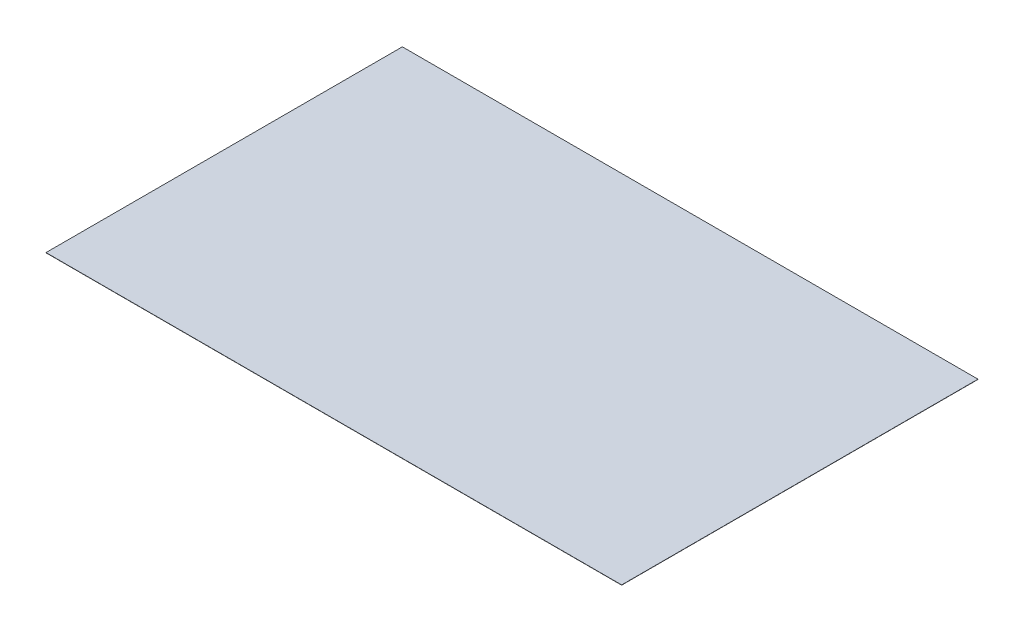
ISO-10303-21;
HEADER;
FILE_DESCRIPTION(('STEP AP214'),'2;1');
FILE_NAME('part.step','',(''),(''),'','','');
FILE_SCHEMA(('AUTOMOTIVE_DESIGN { 1 0 10303 214 1 1 1 1 }'));
ENDSEC;
DATA;
#1=APPLICATION_CONTEXT('core data for automotive mechanical design processes');
#2=APPLICATION_PROTOCOL_DEFINITION('international standard','automotive_design',2000,#1);
#3=PRODUCT_CONTEXT('',#1,'mechanical');
#4=PRODUCT('Part','Part','',(#3));
#5=PRODUCT_RELATED_PRODUCT_CATEGORY('part','',(#4));
#6=PRODUCT_DEFINITION_FORMATION('','',#4);
#7=PRODUCT_DEFINITION_CONTEXT('part definition',#1,'design');
#8=PRODUCT_DEFINITION('design','',#6,#7);
#9=PRODUCT_DEFINITION_SHAPE('','',#8);
#10=(LENGTH_UNIT() NAMED_UNIT(*) SI_UNIT(.MILLI.,.METRE.));
#11=(NAMED_UNIT(*) PLANE_ANGLE_UNIT() SI_UNIT($,.RADIAN.));
#12=(NAMED_UNIT(*) SI_UNIT($,.STERADIAN.) SOLID_ANGLE_UNIT());
#13=UNCERTAINTY_MEASURE_WITH_UNIT(LENGTH_MEASURE(1.E-05),#10,'distance_accuracy_value','');
#14=(GEOMETRIC_REPRESENTATION_CONTEXT(3) GLOBAL_UNCERTAINTY_ASSIGNED_CONTEXT((#13)) GLOBAL_UNIT_ASSIGNED_CONTEXT((#10,
#11,#12)) REPRESENTATION_CONTEXT('',''));
#15=CARTESIAN_POINT('',(0.,0.,0.));
#16=DIRECTION('',(0.,0.,1.));
#17=DIRECTION('',(1.,0.,0.));
#18=AXIS2_PLACEMENT_3D('',#15,#16,#17);
#19=CARTESIAN_POINT('',(-64008.,50.8,-39624.));
#20=DIRECTION('',(1.,0.,0.));
#21=DIRECTION('',(0.,0.,-1.));
#22=AXIS2_PLACEMENT_3D('',#19,#20,#21);
#23=PLANE('',#22);
#24=DIRECTION('',(0.,0.,1.));
#25=VECTOR('',#24,1.);
#26=CARTESIAN_POINT('',(-64008.,0.,-39624.));
#27=LINE('',#26,#25);
#28=CARTESIAN_POINT('',(-64008.,0.,-39624.));
#29=VERTEX_POINT('',#28);
#30=CARTESIAN_POINT('',(-64008.,0.,39624.));
#31=VERTEX_POINT('',#30);
#32=EDGE_CURVE('E100',#29,#31,#27,.T.);
#33=ORIENTED_EDGE('',*,*,#32,.T.);
#34=DIRECTION('',(0.,-1.,0.));
#35=VECTOR('',#34,1.);
#36=CARTESIAN_POINT('',(-64008.,50.8,39624.));
#37=LINE('',#36,#35);
#38=CARTESIAN_POINT('',(-64008.,50.8,39624.));
#39=VERTEX_POINT('',#38);
#40=EDGE_CURVE('E11',#39,#31,#37,.T.);
#41=ORIENTED_EDGE('',*,*,#40,.F.);
#42=DIRECTION('',(0.,0.,1.));
#43=VECTOR('',#42,1.);
#44=CARTESIAN_POINT('',(-64008.,50.8,-39624.));
#45=LINE('',#44,#43);
#46=CARTESIAN_POINT('',(-64008.,50.8,-39624.));
#47=VERTEX_POINT('',#46);
#48=EDGE_CURVE('E86',#47,#39,#45,.T.);
#49=ORIENTED_EDGE('',*,*,#48,.F.);
#50=DIRECTION('',(0.,-1.,0.));
#51=VECTOR('',#50,1.);
#52=CARTESIAN_POINT('',(-64008.,50.8,-39624.));
#53=LINE('',#52,#51);
#54=EDGE_CURVE('E53',#47,#29,#53,.T.);
#55=ORIENTED_EDGE('',*,*,#54,.T.);
#56=EDGE_LOOP('',(#33,#41,#49,#55));
#57=FACE_BOUND('',#56,.T.);
#58=ADVANCED_FACE('F37',(#57),#23,.F.);
#59=CARTESIAN_POINT('',(-64008.,50.8,39624.));
#60=DIRECTION('',(0.,0.,-1.));
#61=DIRECTION('',(-1.,0.,0.));
#62=AXIS2_PLACEMENT_3D('',#59,#60,#61);
#63=PLANE('',#62);
#64=DIRECTION('',(1.,0.,0.));
#65=VECTOR('',#64,1.);
#66=CARTESIAN_POINT('',(-64008.,0.,39624.));
#67=LINE('',#66,#65);
#68=CARTESIAN_POINT('',(64008.,0.,39624.));
#69=VERTEX_POINT('',#68);
#70=EDGE_CURVE('E91',#31,#69,#67,.T.);
#71=ORIENTED_EDGE('',*,*,#70,.T.);
#72=DIRECTION('',(0.,-1.,0.));
#73=VECTOR('',#72,1.);
#74=CARTESIAN_POINT('',(64008.,50.8,39624.));
#75=LINE('',#74,#73);
#76=CARTESIAN_POINT('',(64008.,50.8,39624.));
#77=VERTEX_POINT('',#76);
#78=EDGE_CURVE('E45',#77,#69,#75,.T.);
#79=ORIENTED_EDGE('',*,*,#78,.F.);
#80=DIRECTION('',(1.,0.,0.));
#81=VECTOR('',#80,1.);
#82=CARTESIAN_POINT('',(-64008.,50.8,39624.));
#83=LINE('',#82,#81);
#84=EDGE_CURVE('E78',#39,#77,#83,.T.);
#85=ORIENTED_EDGE('',*,*,#84,.F.);
#86=ORIENTED_EDGE('',*,*,#40,.T.);
#87=EDGE_LOOP('',(#71,#79,#85,#86));
#88=FACE_BOUND('',#87,.T.);
#89=ADVANCED_FACE('F90',(#88),#63,.F.);
#90=CARTESIAN_POINT('',(64008.,50.8,-39624.));
#91=DIRECTION('',(1.,0.,0.));
#92=DIRECTION('',(0.,0.,-1.));
#93=AXIS2_PLACEMENT_3D('',#90,#91,#92);
#94=PLANE('',#93);
#95=DIRECTION('',(0.,0.,1.));
#96=VECTOR('',#95,1.);
#97=CARTESIAN_POINT('',(64008.,0.,-39624.));
#98=LINE('',#97,#96);
#99=CARTESIAN_POINT('',(64008.,0.,-39624.));
#100=VERTEX_POINT('',#99);
#101=EDGE_CURVE('E103',#100,#69,#98,.T.);
#102=ORIENTED_EDGE('',*,*,#101,.F.);
#103=DIRECTION('',(0.,-1.,0.));
#104=VECTOR('',#103,1.);
#105=CARTESIAN_POINT('',(64008.,50.8,-39624.));
#106=LINE('',#105,#104);
#107=CARTESIAN_POINT('',(64008.,50.8,-39624.));
#108=VERTEX_POINT('',#107);
#109=EDGE_CURVE('E67',#108,#100,#106,.T.);
#110=ORIENTED_EDGE('',*,*,#109,.F.);
#111=DIRECTION('',(0.,0.,1.));
#112=VECTOR('',#111,1.);
#113=CARTESIAN_POINT('',(64008.,50.8,-39624.));
#114=LINE('',#113,#112);
#115=EDGE_CURVE('E85',#108,#77,#114,.T.);
#116=ORIENTED_EDGE('',*,*,#115,.T.);
#117=ORIENTED_EDGE('',*,*,#78,.T.);
#118=EDGE_LOOP('',(#102,#110,#116,#117));
#119=FACE_BOUND('',#118,.T.);
#120=ADVANCED_FACE('F94',(#119),#94,.T.);
#121=CARTESIAN_POINT('',(-64008.,50.8,-39624.));
#122=DIRECTION('',(0.,0.,-1.));
#123=DIRECTION('',(-1.,0.,0.));
#124=AXIS2_PLACEMENT_3D('',#121,#122,#123);
#125=PLANE('',#124);
#126=DIRECTION('',(1.,0.,0.));
#127=VECTOR('',#126,1.);
#128=CARTESIAN_POINT('',(-64008.,0.,-39624.));
#129=LINE('',#128,#127);
#130=EDGE_CURVE('E105',#29,#100,#129,.T.);
#131=ORIENTED_EDGE('',*,*,#130,.F.);
#132=ORIENTED_EDGE('',*,*,#54,.F.);
#133=DIRECTION('',(1.,0.,0.));
#134=VECTOR('',#133,1.);
#135=CARTESIAN_POINT('',(-64008.,50.8,-39624.));
#136=LINE('',#135,#134);
#137=EDGE_CURVE('E95',#47,#108,#136,.T.);
#138=ORIENTED_EDGE('',*,*,#137,.T.);
#139=ORIENTED_EDGE('',*,*,#109,.T.);
#140=EDGE_LOOP('',(#131,#132,#138,#139));
#141=FACE_BOUND('',#140,.T.);
#142=ADVANCED_FACE('F111',(#141),#125,.T.);
#143=CARTESIAN_POINT('',(0.,50.8,0.));
#144=DIRECTION('',(0.,1.,0.));
#145=DIRECTION('',(0.,0.,1.));
#146=AXIS2_PLACEMENT_3D('',#143,#144,#145);
#147=PLANE('',#146);
#148=ORIENTED_EDGE('',*,*,#48,.T.);
#149=ORIENTED_EDGE('',*,*,#84,.T.);
#150=ORIENTED_EDGE('',*,*,#115,.F.);
#151=ORIENTED_EDGE('',*,*,#137,.F.);
#152=EDGE_LOOP('',(#148,#149,#150,#151));
#153=FACE_BOUND('',#152,.T.);
#154=ADVANCED_FACE('F82',(#153),#147,.T.);
#155=CARTESIAN_POINT('',(0.,0.,0.));
#156=DIRECTION('',(0.,1.,0.));
#157=DIRECTION('',(0.,0.,1.));
#158=AXIS2_PLACEMENT_3D('',#155,#156,#157);
#159=PLANE('',#158);
#160=ORIENTED_EDGE('',*,*,#32,.F.);
#161=ORIENTED_EDGE('',*,*,#130,.T.);
#162=ORIENTED_EDGE('',*,*,#101,.T.);
#163=ORIENTED_EDGE('',*,*,#70,.F.);
#164=EDGE_LOOP('',(#160,#161,#162,#163));
#165=FACE_BOUND('',#164,.T.);
#166=ADVANCED_FACE('F110',(#165),#159,.F.);
#167=CLOSED_SHELL('',(#58,#89,#120,#142,#154,#166));
#168=MANIFOLD_SOLID_BREP('B2',#167);
#169=ADVANCED_BREP_SHAPE_REPRESENTATION('',(#18,#168),#14);
#170=SHAPE_DEFINITION_REPRESENTATION(#9,#169);
ENDSEC;
END-ISO-10303-21;
